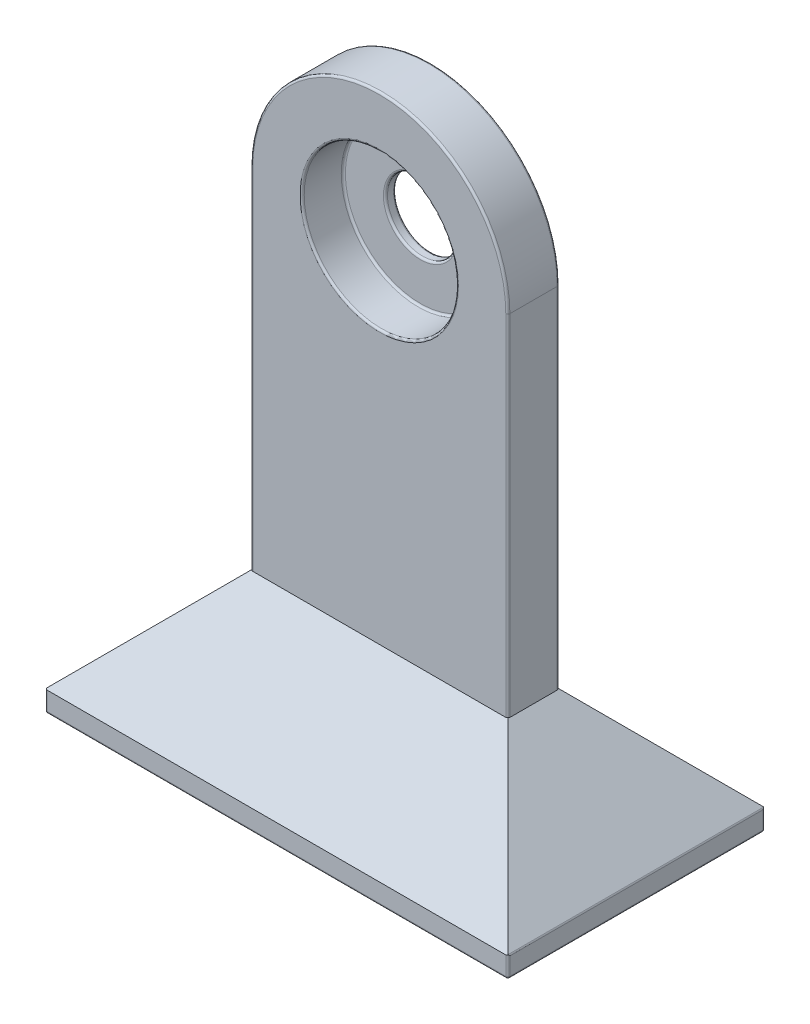
ISO-10303-21;
HEADER;
FILE_DESCRIPTION(('STEP AP214'),'2;1');
FILE_NAME('part.step','',(''),(''),'','','');
FILE_SCHEMA(('AUTOMOTIVE_DESIGN { 1 0 10303 214 1 1 1 1 }'));
ENDSEC;
DATA;
#1=APPLICATION_CONTEXT('core data for automotive mechanical design processes');
#2=APPLICATION_PROTOCOL_DEFINITION('international standard','automotive_design',2000,#1);
#3=PRODUCT_CONTEXT('',#1,'mechanical');
#4=PRODUCT('Part','Part','',(#3));
#5=PRODUCT_RELATED_PRODUCT_CATEGORY('part','',(#4));
#6=PRODUCT_DEFINITION_FORMATION('','',#4);
#7=PRODUCT_DEFINITION_CONTEXT('part definition',#1,'design');
#8=PRODUCT_DEFINITION('design','',#6,#7);
#9=PRODUCT_DEFINITION_SHAPE('','',#8);
#10=(LENGTH_UNIT() NAMED_UNIT(*) SI_UNIT(.MILLI.,.METRE.));
#11=(NAMED_UNIT(*) PLANE_ANGLE_UNIT() SI_UNIT($,.RADIAN.));
#12=(NAMED_UNIT(*) SI_UNIT($,.STERADIAN.) SOLID_ANGLE_UNIT());
#13=UNCERTAINTY_MEASURE_WITH_UNIT(LENGTH_MEASURE(1.E-05),#10,'distance_accuracy_value','');
#14=(GEOMETRIC_REPRESENTATION_CONTEXT(3) GLOBAL_UNCERTAINTY_ASSIGNED_CONTEXT((#13)) GLOBAL_UNIT_ASSIGNED_CONTEXT((#10,
#11,#12)) REPRESENTATION_CONTEXT('',''));
#15=CARTESIAN_POINT('',(0.,0.,0.));
#16=DIRECTION('',(0.,0.,1.));
#17=DIRECTION('',(1.,0.,0.));
#18=AXIS2_PLACEMENT_3D('',#15,#16,#17);
#19=CARTESIAN_POINT('',(0.,0.,2.5));
#20=DIRECTION('',(0.,0.,-1.));
#21=DIRECTION('',(-1.,0.,0.));
#22=AXIS2_PLACEMENT_3D('',#19,#20,#21);
#23=CYLINDRICAL_SURFACE('',#22,7.5);
#24=CARTESIAN_POINT('',(0.,0.,-1.3));
#25=DIRECTION('',(0.,0.,-1.));
#26=DIRECTION('',(-1.,0.,0.));
#27=AXIS2_PLACEMENT_3D('',#24,#25,#26);
#28=CIRCLE('',#27,7.5);
#29=CARTESIAN_POINT('',(-7.5,0.,-1.3));
#30=VERTEX_POINT('',#29);
#31=EDGE_CURVE('E515',#30,#30,#28,.T.);
#32=ORIENTED_EDGE('',*,*,#31,.T.);
#33=EDGE_LOOP('',(#32));
#34=FACE_BOUND('',#33,.T.);
#35=CARTESIAN_POINT('',(0.,0.,2.3));
#36=DIRECTION('',(0.,0.,1.));
#37=DIRECTION('',(1.,0.,0.));
#38=AXIS2_PLACEMENT_3D('',#35,#36,#37);
#39=CIRCLE('',#38,7.5);
#40=CARTESIAN_POINT('',(7.5,0.,2.3));
#41=VERTEX_POINT('',#40);
#42=EDGE_CURVE('E511',#41,#41,#39,.T.);
#43=ORIENTED_EDGE('',*,*,#42,.T.);
#44=EDGE_LOOP('',(#43));
#45=FACE_BOUND('',#44,.T.);
#46=ADVANCED_FACE('F47',(#34,#45),#23,.F.);
#47=CARTESIAN_POINT('',(0.,0.,2.5));
#48=DIRECTION('',(0.,0.,1.));
#49=DIRECTION('',(1.,0.,0.));
#50=AXIS2_PLACEMENT_3D('',#47,#48,#49);
#51=PLANE('',#50);
#52=CARTESIAN_POINT('',(0.,0.,2.5));
#53=DIRECTION('',(0.,0.,1.));
#54=DIRECTION('',(1.,0.,0.));
#55=AXIS2_PLACEMENT_3D('',#52,#53,#54);
#56=CIRCLE('',#55,7.7);
#57=CARTESIAN_POINT('',(7.7,0.,2.5));
#58=VERTEX_POINT('',#57);
#59=EDGE_CURVE('E535',#58,#58,#56,.F.);
#60=ORIENTED_EDGE('',*,*,#59,.T.);
#61=EDGE_LOOP('',(#60));
#62=FACE_BOUND('',#61,.T.);
#63=DIRECTION('',(1.,0.,0.));
#64=VECTOR('',#63,1.);
#65=CARTESIAN_POINT('',(0.,-34.,2.5));
#66=LINE('',#65,#64);
#67=CARTESIAN_POINT('',(-12.3,-34.,2.5));
#68=VERTEX_POINT('',#67);
#69=CARTESIAN_POINT('',(12.3,-34.,2.5));
#70=VERTEX_POINT('',#69);
#71=EDGE_CURVE('E203',#68,#70,#66,.T.);
#72=ORIENTED_EDGE('',*,*,#71,.T.);
#73=DIRECTION('',(0.,1.,0.));
#74=VECTOR('',#73,1.);
#75=CARTESIAN_POINT('',(12.3,0.,2.5));
#76=LINE('',#75,#74);
#77=CARTESIAN_POINT('',(12.3,0.,2.5));
#78=VERTEX_POINT('',#77);
#79=EDGE_CURVE('E212',#70,#78,#76,.T.);
#80=ORIENTED_EDGE('',*,*,#79,.T.);
#81=CARTESIAN_POINT('',(0.,0.,2.5));
#82=DIRECTION('',(0.,0.,1.));
#83=DIRECTION('',(1.,0.,0.));
#84=AXIS2_PLACEMENT_3D('',#81,#82,#83);
#85=CIRCLE('',#84,12.3);
#86=CARTESIAN_POINT('',(-12.3,0.,2.5));
#87=VERTEX_POINT('',#86);
#88=EDGE_CURVE('E206',#78,#87,#85,.T.);
#89=ORIENTED_EDGE('',*,*,#88,.T.);
#90=DIRECTION('',(0.,-1.,0.));
#91=VECTOR('',#90,1.);
#92=CARTESIAN_POINT('',(-12.3,-34.,2.5));
#93=LINE('',#92,#91);
#94=EDGE_CURVE('E199',#87,#68,#93,.T.);
#95=ORIENTED_EDGE('',*,*,#94,.T.);
#96=EDGE_LOOP('',(#72,#80,#89,#95));
#97=FACE_BOUND('',#96,.T.);
#98=ADVANCED_FACE('F201',(#62,#97),#51,.T.);
#99=CARTESIAN_POINT('',(0.,0.,-2.5));
#100=DIRECTION('',(0.,0.,1.));
#101=DIRECTION('',(1.,0.,0.));
#102=AXIS2_PLACEMENT_3D('',#99,#100,#101);
#103=PLANE('',#102);
#104=CARTESIAN_POINT('',(0.,0.,-2.5));
#105=DIRECTION('',(0.,0.,1.));
#106=DIRECTION('',(1.,0.,0.));
#107=AXIS2_PLACEMENT_3D('',#104,#105,#106);
#108=CIRCLE('',#107,3.6);
#109=CARTESIAN_POINT('',(3.6,0.,-2.5));
#110=VERTEX_POINT('',#109);
#111=EDGE_CURVE('E563',#110,#110,#108,.T.);
#112=ORIENTED_EDGE('',*,*,#111,.T.);
#113=EDGE_LOOP('',(#112));
#114=FACE_BOUND('',#113,.T.);
#115=CARTESIAN_POINT('',(0.,0.,-2.5));
#116=DIRECTION('',(0.,0.,1.));
#117=DIRECTION('',(1.,0.,0.));
#118=AXIS2_PLACEMENT_3D('',#115,#116,#117);
#119=CIRCLE('',#118,12.3);
#120=CARTESIAN_POINT('',(-12.3,0.,-2.5));
#121=VERTEX_POINT('',#120);
#122=CARTESIAN_POINT('',(12.3,0.,-2.5));
#123=VERTEX_POINT('',#122);
#124=EDGE_CURVE('E554',#121,#123,#119,.F.);
#125=ORIENTED_EDGE('',*,*,#124,.T.);
#126=DIRECTION('',(0.,1.,0.));
#127=VECTOR('',#126,1.);
#128=CARTESIAN_POINT('',(12.3,0.,-2.5));
#129=LINE('',#128,#127);
#130=CARTESIAN_POINT('',(12.3,-34.,-2.50000000000001));
#131=VERTEX_POINT('',#130);
#132=EDGE_CURVE('E560',#123,#131,#129,.F.);
#133=ORIENTED_EDGE('',*,*,#132,.T.);
#134=DIRECTION('',(1.,0.,0.));
#135=VECTOR('',#134,1.);
#136=CARTESIAN_POINT('',(0.,-34.,-2.50000000000001));
#137=LINE('',#136,#135);
#138=CARTESIAN_POINT('',(-12.3,-34.,-2.50000000000001));
#139=VERTEX_POINT('',#138);
#140=EDGE_CURVE('E224',#139,#131,#137,.T.);
#141=ORIENTED_EDGE('',*,*,#140,.F.);
#142=DIRECTION('',(0.,-1.,0.));
#143=VECTOR('',#142,1.);
#144=CARTESIAN_POINT('',(-12.3,0.,-2.5));
#145=LINE('',#144,#143);
#146=EDGE_CURVE('E557',#139,#121,#145,.F.);
#147=ORIENTED_EDGE('',*,*,#146,.T.);
#148=EDGE_LOOP('',(#125,#133,#141,#147));
#149=FACE_BOUND('',#148,.T.);
#150=ADVANCED_FACE('F657',(#114,#149),#103,.F.);
#151=CARTESIAN_POINT('',(0.,0.,2.5));
#152=DIRECTION('',(0.,0.,-1.));
#153=DIRECTION('',(-1.,0.,0.));
#154=AXIS2_PLACEMENT_3D('',#151,#152,#153);
#155=CYLINDRICAL_SURFACE('',#154,12.5);
#156=DIRECTION('',(0.,0.,-1.));
#157=VECTOR('',#156,1.);
#158=CARTESIAN_POINT('',(-12.5,0.,2.5));
#159=LINE('',#158,#157);
#160=CARTESIAN_POINT('',(-12.5,0.,2.3));
#161=VERTEX_POINT('',#160);
#162=CARTESIAN_POINT('',(-12.5,0.,-2.3));
#163=VERTEX_POINT('',#162);
#164=EDGE_CURVE('E333',#161,#163,#159,.T.);
#165=ORIENTED_EDGE('',*,*,#164,.F.);
#166=CARTESIAN_POINT('',(0.,0.,2.3));
#167=DIRECTION('',(0.,0.,1.));
#168=DIRECTION('',(1.,0.,0.));
#169=AXIS2_PLACEMENT_3D('',#166,#167,#168);
#170=CIRCLE('',#169,12.5);
#171=CARTESIAN_POINT('',(12.5,0.,2.3));
#172=VERTEX_POINT('',#171);
#173=EDGE_CURVE('E522',#161,#172,#170,.F.);
#174=ORIENTED_EDGE('',*,*,#173,.T.);
#175=DIRECTION('',(0.,0.,-1.));
#176=VECTOR('',#175,1.);
#177=CARTESIAN_POINT('',(12.5,0.,2.5));
#178=LINE('',#177,#176);
#179=CARTESIAN_POINT('',(12.5,0.,-2.3));
#180=VERTEX_POINT('',#179);
#181=EDGE_CURVE('E223',#172,#180,#178,.T.);
#182=ORIENTED_EDGE('',*,*,#181,.T.);
#183=CARTESIAN_POINT('',(0.,0.,-2.3));
#184=DIRECTION('',(0.,0.,1.));
#185=DIRECTION('',(1.,0.,0.));
#186=AXIS2_PLACEMENT_3D('',#183,#184,#185);
#187=CIRCLE('',#186,12.5);
#188=EDGE_CURVE('E519',#180,#163,#187,.T.);
#189=ORIENTED_EDGE('',*,*,#188,.T.);
#190=EDGE_LOOP('',(#165,#174,#182,#189));
#191=FACE_BOUND('',#190,.T.);
#192=ADVANCED_FACE('F673',(#191),#155,.T.);
#193=CARTESIAN_POINT('',(-12.5,0.,2.5));
#194=DIRECTION('',(1.,0.,0.));
#195=DIRECTION('',(0.,1.,0.));
#196=AXIS2_PLACEMENT_3D('',#193,#194,#195);
#197=PLANE('',#196);
#198=DIRECTION('',(0.,0.,1.));
#199=VECTOR('',#198,1.);
#200=CARTESIAN_POINT('',(-12.5,-34.,0.));
#201=LINE('',#200,#199);
#202=CARTESIAN_POINT('',(-12.5,-34.,2.3));
#203=VERTEX_POINT('',#202);
#204=CARTESIAN_POINT('',(-12.5,-34.,-2.3));
#205=VERTEX_POINT('',#204);
#206=EDGE_CURVE('E337',#203,#205,#201,.F.);
#207=ORIENTED_EDGE('',*,*,#206,.F.);
#208=DIRECTION('',(0.,-1.,0.));
#209=VECTOR('',#208,1.);
#210=CARTESIAN_POINT('',(-12.5,0.,2.3));
#211=LINE('',#210,#209);
#212=EDGE_CURVE('E551',#203,#161,#211,.F.);
#213=ORIENTED_EDGE('',*,*,#212,.T.);
#214=ORIENTED_EDGE('',*,*,#164,.T.);
#215=DIRECTION('',(0.,-1.,0.));
#216=VECTOR('',#215,1.);
#217=CARTESIAN_POINT('',(-12.5,0.,-2.3));
#218=LINE('',#217,#216);
#219=EDGE_CURVE('E548',#163,#205,#218,.T.);
#220=ORIENTED_EDGE('',*,*,#219,.T.);
#221=EDGE_LOOP('',(#207,#213,#214,#220));
#222=FACE_BOUND('',#221,.T.);
#223=ADVANCED_FACE('F679',(#222),#197,.F.);
#224=CARTESIAN_POINT('',(12.5,-34.,2.5));
#225=DIRECTION('',(-1.,0.,0.));
#226=DIRECTION('',(0.,-1.,0.));
#227=AXIS2_PLACEMENT_3D('',#224,#225,#226);
#228=PLANE('',#227);
#229=ORIENTED_EDGE('',*,*,#181,.F.);
#230=DIRECTION('',(0.,1.,0.));
#231=VECTOR('',#230,1.);
#232=CARTESIAN_POINT('',(12.5,-34.,2.3));
#233=LINE('',#232,#231);
#234=CARTESIAN_POINT('',(12.5,-34.,2.3));
#235=VERTEX_POINT('',#234);
#236=EDGE_CURVE('E545',#172,#235,#233,.F.);
#237=ORIENTED_EDGE('',*,*,#236,.T.);
#238=DIRECTION('',(0.,0.,1.));
#239=VECTOR('',#238,1.);
#240=CARTESIAN_POINT('',(12.5,-34.,2.5));
#241=LINE('',#240,#239);
#242=CARTESIAN_POINT('',(12.5,-34.,-2.3));
#243=VERTEX_POINT('',#242);
#244=EDGE_CURVE('E332',#235,#243,#241,.F.);
#245=ORIENTED_EDGE('',*,*,#244,.T.);
#246=DIRECTION('',(0.,1.,0.));
#247=VECTOR('',#246,1.);
#248=CARTESIAN_POINT('',(12.5,-34.,-2.3));
#249=LINE('',#248,#247);
#250=EDGE_CURVE('E539',#243,#180,#249,.T.);
#251=ORIENTED_EDGE('',*,*,#250,.T.);
#252=EDGE_LOOP('',(#229,#237,#245,#251));
#253=FACE_BOUND('',#252,.T.);
#254=ADVANCED_FACE('F672',(#253),#228,.F.);
#255=CARTESIAN_POINT('',(0.,0.,-1.5));
#256=DIRECTION('',(0.,0.,-1.));
#257=DIRECTION('',(-1.,0.,0.));
#258=AXIS2_PLACEMENT_3D('',#255,#256,#257);
#259=PLANE('',#258);
#260=CARTESIAN_POINT('',(0.,0.,-1.5));
#261=DIRECTION('',(0.,0.,-1.));
#262=DIRECTION('',(-1.,0.,0.));
#263=AXIS2_PLACEMENT_3D('',#260,#261,#262);
#264=CIRCLE('',#263,3.6);
#265=CARTESIAN_POINT('',(-3.6,0.,-1.5));
#266=VERTEX_POINT('',#265);
#267=EDGE_CURVE('E507',#266,#266,#264,.T.);
#268=ORIENTED_EDGE('',*,*,#267,.T.);
#269=EDGE_LOOP('',(#268));
#270=FACE_BOUND('',#269,.T.);
#271=CARTESIAN_POINT('',(0.,0.,-1.5));
#272=DIRECTION('',(0.,0.,-1.));
#273=DIRECTION('',(-1.,0.,0.));
#274=AXIS2_PLACEMENT_3D('',#271,#272,#273);
#275=CIRCLE('',#274,7.3);
#276=CARTESIAN_POINT('',(-7.3,0.,-1.5));
#277=VERTEX_POINT('',#276);
#278=EDGE_CURVE('E503',#277,#277,#275,.F.);
#279=ORIENTED_EDGE('',*,*,#278,.T.);
#280=EDGE_LOOP('',(#279));
#281=FACE_BOUND('',#280,.T.);
#282=ADVANCED_FACE('F686',(#270,#281),#259,.F.);
#283=CARTESIAN_POINT('',(0.,0.,-1.5));
#284=DIRECTION('',(0.,0.,-1.));
#285=DIRECTION('',(-1.,0.,0.));
#286=AXIS2_PLACEMENT_3D('',#283,#284,#285);
#287=CYLINDRICAL_SURFACE('',#286,3.4);
#288=CARTESIAN_POINT('',(0.,0.,-2.3));
#289=DIRECTION('',(0.,0.,1.));
#290=DIRECTION('',(1.,0.,0.));
#291=AXIS2_PLACEMENT_3D('',#288,#289,#290);
#292=CIRCLE('',#291,3.4);
#293=CARTESIAN_POINT('',(3.4,0.,-2.3));
#294=VERTEX_POINT('',#293);
#295=EDGE_CURVE('E499',#294,#294,#292,.F.);
#296=ORIENTED_EDGE('',*,*,#295,.T.);
#297=EDGE_LOOP('',(#296));
#298=FACE_BOUND('',#297,.T.);
#299=CARTESIAN_POINT('',(0.,0.,-1.7));
#300=DIRECTION('',(0.,0.,-1.));
#301=DIRECTION('',(-1.,0.,0.));
#302=AXIS2_PLACEMENT_3D('',#299,#300,#301);
#303=CIRCLE('',#302,3.4);
#304=CARTESIAN_POINT('',(-3.4,0.,-1.7));
#305=VERTEX_POINT('',#304);
#306=EDGE_CURVE('E495',#305,#305,#303,.F.);
#307=ORIENTED_EDGE('',*,*,#306,.T.);
#308=EDGE_LOOP('',(#307));
#309=FACE_BOUND('',#308,.T.);
#310=ADVANCED_FACE('F377',(#298,#309),#287,.F.);
#311=CARTESIAN_POINT('',(-10.75,-10.75,0.));
#312=DIRECTION('',(-0.707106781186548,-0.707106781186548,0.));
#313=DIRECTION('',(0.707106781186548,-0.707106781186548,0.));
#314=AXIS2_PLACEMENT_3D('',#311,#312,#313);
#315=PLANE('',#314);
#316=DIRECTION('',(-0.577350269189626,0.577350269189626,-0.577350269189626));
#317=VECTOR('',#316,1.);
#318=CARTESIAN_POINT('',(22.5,-44.,12.5));
#319=LINE('',#318,#317);
#320=CARTESIAN_POINT('',(22.4414213562373,-43.9414213562373,12.4414213562373));
#321=VERTEX_POINT('',#320);
#322=CARTESIAN_POINT('',(12.4414213562373,-33.9414213562373,2.44142135623731));
#323=VERTEX_POINT('',#322);
#324=EDGE_CURVE('E447',#321,#323,#319,.T.);
#325=ORIENTED_EDGE('',*,*,#324,.F.);
#326=DIRECTION('',(0.,0.,1.));
#327=VECTOR('',#326,1.);
#328=CARTESIAN_POINT('',(22.4414213562373,-43.9414213562373,0.));
#329=LINE('',#328,#327);
#330=CARTESIAN_POINT('',(22.4414213562373,-43.9414213562373,-12.4414213562373));
#331=VERTEX_POINT('',#330);
#332=EDGE_CURVE('E479',#321,#331,#329,.F.);
#333=ORIENTED_EDGE('',*,*,#332,.T.);
#334=DIRECTION('',(-0.577350269189626,0.577350269189626,0.577350269189626));
#335=VECTOR('',#334,1.);
#336=CARTESIAN_POINT('',(22.5,-44.,-12.5));
#337=LINE('',#336,#335);
#338=CARTESIAN_POINT('',(12.4414213562373,-33.9414213562373,-2.44142135623731));
#339=VERTEX_POINT('',#338);
#340=EDGE_CURVE('E73',#331,#339,#337,.T.);
#341=ORIENTED_EDGE('',*,*,#340,.T.);
#342=CARTESIAN_POINT('',(12.3,-33.8,-2.3));
#343=DIRECTION('',(-0.707106781186548,-0.707106781186548,0.));
#344=DIRECTION('',(-0.707106781186548,0.707106781186548,0.));
#345=AXIS2_PLACEMENT_3D('',#342,#343,#344);
#346=ELLIPSE('',#345,0.282842712474619,0.2);
#347=EDGE_CURVE('E241',#339,#243,#346,.T.);
#348=ORIENTED_EDGE('',*,*,#347,.T.);
#349=ORIENTED_EDGE('',*,*,#244,.F.);
#350=CARTESIAN_POINT('',(12.3,-33.8,2.3));
#351=DIRECTION('',(-0.707106781186548,-0.707106781186548,0.));
#352=DIRECTION('',(0.707106781186548,-0.707106781186548,0.));
#353=AXIS2_PLACEMENT_3D('',#350,#351,#352);
#354=ELLIPSE('',#353,0.282842712474619,0.2);
#355=EDGE_CURVE('E235',#235,#323,#354,.T.);
#356=ORIENTED_EDGE('',*,*,#355,.T.);
#357=EDGE_LOOP('',(#325,#333,#341,#348,#349,#356));
#358=FACE_BOUND('',#357,.T.);
#359=ADVANCED_FACE('F374',(#358),#315,.F.);
#360=CARTESIAN_POINT('',(0.,-15.75,-15.75));
#361=DIRECTION('',(0.,-0.707106781186547,-0.707106781186547));
#362=DIRECTION('',(0.,0.707106781186548,-0.707106781186547));
#363=AXIS2_PLACEMENT_3D('',#360,#361,#362);
#364=PLANE('',#363);
#365=DIRECTION('',(0.577350269189626,0.577350269189626,-0.577350269189626));
#366=VECTOR('',#365,1.);
#367=CARTESIAN_POINT('',(-22.5,-44.,12.5));
#368=LINE('',#367,#366);
#369=CARTESIAN_POINT('',(-22.4414213562373,-43.9414213562373,12.4414213562373));
#370=VERTEX_POINT('',#369);
#371=CARTESIAN_POINT('',(-12.4414213562373,-33.9414213562373,2.44142135623731));
#372=VERTEX_POINT('',#371);
#373=EDGE_CURVE('E347',#370,#372,#368,.T.);
#374=ORIENTED_EDGE('',*,*,#373,.F.);
#375=CARTESIAN_POINT('',(-22.3,-43.8,12.3));
#376=DIRECTION('',(0.,-0.707106781186547,-0.707106781186547));
#377=DIRECTION('',(0.,0.707106781186548,-0.707106781186547));
#378=AXIS2_PLACEMENT_3D('',#375,#376,#377);
#379=ELLIPSE('',#378,0.282842712474619,0.2);
#380=CARTESIAN_POINT('',(-22.3,-44.,12.5));
#381=VERTEX_POINT('',#380);
#382=EDGE_CURVE('E404',#370,#381,#379,.F.);
#383=ORIENTED_EDGE('',*,*,#382,.T.);
#384=DIRECTION('',(-1.,0.,0.));
#385=VECTOR('',#384,1.);
#386=CARTESIAN_POINT('',(22.5,-44.,12.5));
#387=LINE('',#386,#385);
#388=CARTESIAN_POINT('',(22.3,-44.,12.5));
#389=VERTEX_POINT('',#388);
#390=EDGE_CURVE('E51',#389,#381,#387,.T.);
#391=ORIENTED_EDGE('',*,*,#390,.F.);
#392=CARTESIAN_POINT('',(22.3,-43.8,12.3));
#393=DIRECTION('',(0.,-0.707106781186547,-0.707106781186547));
#394=DIRECTION('',(0.,0.707106781186548,-0.707106781186547));
#395=AXIS2_PLACEMENT_3D('',#392,#393,#394);
#396=ELLIPSE('',#395,0.282842712474619,0.2);
#397=EDGE_CURVE('E401',#389,#321,#396,.F.);
#398=ORIENTED_EDGE('',*,*,#397,.T.);
#399=ORIENTED_EDGE('',*,*,#324,.T.);
#400=CARTESIAN_POINT('',(12.3,-33.8,2.3));
#401=DIRECTION('',(0.,-0.707106781186547,-0.707106781186547));
#402=DIRECTION('',(0.,-0.707106781186548,0.707106781186547));
#403=AXIS2_PLACEMENT_3D('',#400,#401,#402);
#404=ELLIPSE('',#403,0.282842712474619,0.2);
#405=EDGE_CURVE('E221',#323,#70,#404,.T.);
#406=ORIENTED_EDGE('',*,*,#405,.T.);
#407=ORIENTED_EDGE('',*,*,#71,.F.);
#408=CARTESIAN_POINT('',(-12.3,-33.8,2.3));
#409=DIRECTION('',(0.,-0.707106781186547,-0.707106781186547));
#410=DIRECTION('',(0.,0.707106781186548,-0.707106781186547));
#411=AXIS2_PLACEMENT_3D('',#408,#409,#410);
#412=ELLIPSE('',#411,0.282842712474619,0.2);
#413=EDGE_CURVE('E218',#68,#372,#412,.T.);
#414=ORIENTED_EDGE('',*,*,#413,.T.);
#415=EDGE_LOOP('',(#374,#383,#391,#398,#399,#406,#407,#414));
#416=FACE_BOUND('',#415,.T.);
#417=ADVANCED_FACE('F217',(#416),#364,.F.);
#418=CARTESIAN_POINT('',(0.,-15.75,15.75));
#419=DIRECTION('',(0.,-0.707106781186547,0.707106781186547));
#420=DIRECTION('',(0.,-0.707106781186548,-0.707106781186547));
#421=AXIS2_PLACEMENT_3D('',#418,#419,#420);
#422=PLANE('',#421);
#423=DIRECTION('',(1.,0.,0.));
#424=VECTOR('',#423,1.);
#425=CARTESIAN_POINT('',(22.5,-44.,-12.5));
#426=LINE('',#425,#424);
#427=CARTESIAN_POINT('',(-22.3,-44.,-12.5));
#428=VERTEX_POINT('',#427);
#429=CARTESIAN_POINT('',(22.3,-44.,-12.5));
#430=VERTEX_POINT('',#429);
#431=EDGE_CURVE('E319',#428,#430,#426,.T.);
#432=ORIENTED_EDGE('',*,*,#431,.F.);
#433=CARTESIAN_POINT('',(-22.3,-43.8,-12.3));
#434=DIRECTION('',(0.,-0.707106781186547,0.707106781186547));
#435=DIRECTION('',(0.,0.707106781186548,0.707106781186547));
#436=AXIS2_PLACEMENT_3D('',#433,#434,#435);
#437=ELLIPSE('',#436,0.282842712474619,0.2);
#438=CARTESIAN_POINT('',(-22.4414213562373,-43.9414213562373,-12.4414213562373));
#439=VERTEX_POINT('',#438);
#440=EDGE_CURVE('E455',#428,#439,#437,.F.);
#441=ORIENTED_EDGE('',*,*,#440,.T.);
#442=DIRECTION('',(0.577350269189626,0.577350269189626,0.577350269189626));
#443=VECTOR('',#442,1.);
#444=CARTESIAN_POINT('',(-22.5,-44.,-12.5));
#445=LINE('',#444,#443);
#446=CARTESIAN_POINT('',(-12.4414213562373,-33.9414213562373,-2.44142135623731));
#447=VERTEX_POINT('',#446);
#448=EDGE_CURVE('E65',#439,#447,#445,.T.);
#449=ORIENTED_EDGE('',*,*,#448,.T.);
#450=CARTESIAN_POINT('',(-12.3,-33.8,-2.3));
#451=DIRECTION('',(0.,-0.707106781186547,0.707106781186547));
#452=DIRECTION('',(0.,-0.707106781186548,-0.707106781186547));
#453=AXIS2_PLACEMENT_3D('',#450,#451,#452);
#454=ELLIPSE('',#453,0.282842712474619,0.2);
#455=EDGE_CURVE('E12',#447,#139,#454,.T.);
#456=ORIENTED_EDGE('',*,*,#455,.T.);
#457=ORIENTED_EDGE('',*,*,#140,.T.);
#458=CARTESIAN_POINT('',(12.3,-33.8,-2.3));
#459=DIRECTION('',(0.,-0.707106781186547,0.707106781186547));
#460=DIRECTION('',(0.,0.707106781186548,0.707106781186547));
#461=AXIS2_PLACEMENT_3D('',#458,#459,#460);
#462=ELLIPSE('',#461,0.282842712474619,0.2);
#463=EDGE_CURVE('E233',#131,#339,#462,.T.);
#464=ORIENTED_EDGE('',*,*,#463,.T.);
#465=ORIENTED_EDGE('',*,*,#340,.F.);
#466=CARTESIAN_POINT('',(22.3,-43.8,-12.3));
#467=DIRECTION('',(0.,-0.707106781186547,0.707106781186547));
#468=DIRECTION('',(0.,0.707106781186548,0.707106781186547));
#469=AXIS2_PLACEMENT_3D('',#466,#467,#468);
#470=ELLIPSE('',#469,0.282842712474619,0.2);
#471=EDGE_CURVE('E452',#331,#430,#470,.F.);
#472=ORIENTED_EDGE('',*,*,#471,.T.);
#473=EDGE_LOOP('',(#432,#441,#449,#456,#457,#464,#465,#472));
#474=FACE_BOUND('',#473,.T.);
#475=ADVANCED_FACE('F381',(#474),#422,.F.);
#476=CARTESIAN_POINT('',(10.75,-10.75,0.));
#477=DIRECTION('',(0.707106781186548,-0.707106781186548,0.));
#478=DIRECTION('',(0.707106781186548,0.707106781186548,0.));
#479=AXIS2_PLACEMENT_3D('',#476,#477,#478);
#480=PLANE('',#479);
#481=ORIENTED_EDGE('',*,*,#448,.F.);
#482=DIRECTION('',(0.,0.,-1.));
#483=VECTOR('',#482,1.);
#484=CARTESIAN_POINT('',(-22.4414213562373,-43.9414213562373,0.));
#485=LINE('',#484,#483);
#486=EDGE_CURVE('E461',#439,#370,#485,.F.);
#487=ORIENTED_EDGE('',*,*,#486,.T.);
#488=ORIENTED_EDGE('',*,*,#373,.T.);
#489=CARTESIAN_POINT('',(-12.3,-33.8,2.3));
#490=DIRECTION('',(0.707106781186548,-0.707106781186548,0.));
#491=DIRECTION('',(0.707106781186548,0.707106781186548,0.));
#492=AXIS2_PLACEMENT_3D('',#489,#490,#491);
#493=ELLIPSE('',#492,0.282842712474619,0.2);
#494=EDGE_CURVE('E228',#372,#203,#493,.T.);
#495=ORIENTED_EDGE('',*,*,#494,.T.);
#496=ORIENTED_EDGE('',*,*,#206,.T.);
#497=CARTESIAN_POINT('',(-12.3,-33.8,-2.3));
#498=DIRECTION('',(0.707106781186548,-0.707106781186548,0.));
#499=DIRECTION('',(-0.707106781186548,-0.707106781186548,0.));
#500=AXIS2_PLACEMENT_3D('',#497,#498,#499);
#501=ELLIPSE('',#500,0.282842712474619,0.2);
#502=EDGE_CURVE('E58',#205,#447,#501,.T.);
#503=ORIENTED_EDGE('',*,*,#502,.T.);
#504=EDGE_LOOP('',(#481,#487,#488,#495,#496,#503));
#505=FACE_BOUND('',#504,.T.);
#506=ADVANCED_FACE('F372',(#505),#480,.F.);
#507=CARTESIAN_POINT('',(-22.5,-46.,12.5));
#508=DIRECTION('',(1.,0.,0.));
#509=DIRECTION('',(0.,0.,-1.));
#510=AXIS2_PLACEMENT_3D('',#507,#508,#509);
#511=PLANE('',#510);
#512=DIRECTION('',(0.,1.,0.));
#513=VECTOR('',#512,1.);
#514=CARTESIAN_POINT('',(-22.5,-46.,12.3));
#515=LINE('',#514,#513);
#516=CARTESIAN_POINT('',(-22.5,-45.8,12.3));
#517=VERTEX_POINT('',#516);
#518=CARTESIAN_POINT('',(-22.5,-44.0828427124746,12.3));
#519=VERTEX_POINT('',#518);
#520=EDGE_CURVE('E573',#517,#519,#515,.T.);
#521=ORIENTED_EDGE('',*,*,#520,.T.);
#522=DIRECTION('',(0.,0.,-1.));
#523=VECTOR('',#522,1.);
#524=CARTESIAN_POINT('',(-22.5,-44.0828427124746,12.5));
#525=LINE('',#524,#523);
#526=CARTESIAN_POINT('',(-22.5,-44.0828427124746,-12.3));
#527=VERTEX_POINT('',#526);
#528=EDGE_CURVE('E405',#519,#527,#525,.T.);
#529=ORIENTED_EDGE('',*,*,#528,.T.);
#530=DIRECTION('',(0.,1.,0.));
#531=VECTOR('',#530,1.);
#532=CARTESIAN_POINT('',(-22.5,-46.,-12.3));
#533=LINE('',#532,#531);
#534=CARTESIAN_POINT('',(-22.5,-45.8,-12.3));
#535=VERTEX_POINT('',#534);
#536=EDGE_CURVE('E570',#527,#535,#533,.F.);
#537=ORIENTED_EDGE('',*,*,#536,.T.);
#538=DIRECTION('',(0.,0.,-1.));
#539=VECTOR('',#538,1.);
#540=CARTESIAN_POINT('',(-22.5,-45.8,12.5));
#541=LINE('',#540,#539);
#542=EDGE_CURVE('E567',#535,#517,#541,.F.);
#543=ORIENTED_EDGE('',*,*,#542,.T.);
#544=EDGE_LOOP('',(#521,#529,#537,#543));
#545=FACE_BOUND('',#544,.T.);
#546=ADVANCED_FACE('F368',(#545),#511,.F.);
#547=CARTESIAN_POINT('',(-22.5,-46.,-12.5));
#548=DIRECTION('',(0.,0.,1.));
#549=DIRECTION('',(1.,0.,0.));
#550=AXIS2_PLACEMENT_3D('',#547,#548,#549);
#551=PLANE('',#550);
#552=DIRECTION('',(1.,0.,0.));
#553=VECTOR('',#552,1.);
#554=CARTESIAN_POINT('',(-22.5,-45.8,-12.5));
#555=LINE('',#554,#553);
#556=CARTESIAN_POINT('',(22.3,-45.8,-12.5));
#557=VERTEX_POINT('',#556);
#558=CARTESIAN_POINT('',(-22.3,-45.8,-12.5));
#559=VERTEX_POINT('',#558);
#560=EDGE_CURVE('E424',#557,#559,#555,.F.);
#561=ORIENTED_EDGE('',*,*,#560,.T.);
#562=DIRECTION('',(0.,1.,0.));
#563=VECTOR('',#562,1.);
#564=CARTESIAN_POINT('',(-22.3,-46.,-12.5));
#565=LINE('',#564,#563);
#566=EDGE_CURVE('E456',#559,#428,#565,.T.);
#567=ORIENTED_EDGE('',*,*,#566,.T.);
#568=ORIENTED_EDGE('',*,*,#431,.T.);
#569=DIRECTION('',(0.,1.,0.));
#570=VECTOR('',#569,1.);
#571=CARTESIAN_POINT('',(22.3,-46.,-12.5));
#572=LINE('',#571,#570);
#573=EDGE_CURVE('E636',#430,#557,#572,.F.);
#574=ORIENTED_EDGE('',*,*,#573,.T.);
#575=EDGE_LOOP('',(#561,#567,#568,#574));
#576=FACE_BOUND('',#575,.T.);
#577=ADVANCED_FACE('F357',(#576),#551,.F.);
#578=CARTESIAN_POINT('',(22.5,-46.,12.5));
#579=DIRECTION('',(-1.,0.,0.));
#580=DIRECTION('',(0.,0.,1.));
#581=AXIS2_PLACEMENT_3D('',#578,#579,#580);
#582=PLANE('',#581);
#583=DIRECTION('',(0.,1.,0.));
#584=VECTOR('',#583,1.);
#585=CARTESIAN_POINT('',(22.5,-46.,-12.3));
#586=LINE('',#585,#584);
#587=CARTESIAN_POINT('',(22.5,-45.8,-12.3));
#588=VERTEX_POINT('',#587);
#589=CARTESIAN_POINT('',(22.5,-44.0828427124746,-12.3));
#590=VERTEX_POINT('',#589);
#591=EDGE_CURVE('E472',#588,#590,#586,.T.);
#592=ORIENTED_EDGE('',*,*,#591,.T.);
#593=DIRECTION('',(0.,0.,1.));
#594=VECTOR('',#593,1.);
#595=CARTESIAN_POINT('',(22.5,-44.0828427124746,12.5));
#596=LINE('',#595,#594);
#597=CARTESIAN_POINT('',(22.5,-44.0828427124746,12.3));
#598=VERTEX_POINT('',#597);
#599=EDGE_CURVE('E476',#590,#598,#596,.T.);
#600=ORIENTED_EDGE('',*,*,#599,.T.);
#601=DIRECTION('',(0.,1.,0.));
#602=VECTOR('',#601,1.);
#603=CARTESIAN_POINT('',(22.5,-46.,12.3));
#604=LINE('',#603,#602);
#605=CARTESIAN_POINT('',(22.5,-45.8,12.3));
#606=VERTEX_POINT('',#605);
#607=EDGE_CURVE('E469',#598,#606,#604,.F.);
#608=ORIENTED_EDGE('',*,*,#607,.T.);
#609=DIRECTION('',(0.,0.,1.));
#610=VECTOR('',#609,1.);
#611=CARTESIAN_POINT('',(22.5,-45.8,-12.5));
#612=LINE('',#611,#610);
#613=EDGE_CURVE('E466',#606,#588,#612,.F.);
#614=ORIENTED_EDGE('',*,*,#613,.T.);
#615=EDGE_LOOP('',(#592,#600,#608,#614));
#616=FACE_BOUND('',#615,.T.);
#617=ADVANCED_FACE('F367',(#616),#582,.F.);
#618=CARTESIAN_POINT('',(-22.5,-46.,12.5));
#619=DIRECTION('',(0.,0.,-1.));
#620=DIRECTION('',(-1.,0.,0.));
#621=AXIS2_PLACEMENT_3D('',#618,#619,#620);
#622=PLANE('',#621);
#623=ORIENTED_EDGE('',*,*,#390,.T.);
#624=DIRECTION('',(0.,1.,0.));
#625=VECTOR('',#624,1.);
#626=CARTESIAN_POINT('',(-22.3,-46.,12.5));
#627=LINE('',#626,#625);
#628=CARTESIAN_POINT('',(-22.3,-45.8,12.5));
#629=VERTEX_POINT('',#628);
#630=EDGE_CURVE('E418',#381,#629,#627,.F.);
#631=ORIENTED_EDGE('',*,*,#630,.T.);
#632=DIRECTION('',(-1.,0.,0.));
#633=VECTOR('',#632,1.);
#634=CARTESIAN_POINT('',(22.5,-45.8,12.5));
#635=LINE('',#634,#633);
#636=CARTESIAN_POINT('',(22.3,-45.8,12.5));
#637=VERTEX_POINT('',#636);
#638=EDGE_CURVE('E410',#629,#637,#635,.F.);
#639=ORIENTED_EDGE('',*,*,#638,.T.);
#640=DIRECTION('',(0.,1.,0.));
#641=VECTOR('',#640,1.);
#642=CARTESIAN_POINT('',(22.3,-46.,12.5));
#643=LINE('',#642,#641);
#644=EDGE_CURVE('E415',#637,#389,#643,.T.);
#645=ORIENTED_EDGE('',*,*,#644,.T.);
#646=EDGE_LOOP('',(#623,#631,#639,#645));
#647=FACE_BOUND('',#646,.T.);
#648=ADVANCED_FACE('F595',(#647),#622,.F.);
#649=CARTESIAN_POINT('',(0.,-46.,0.));
#650=DIRECTION('',(0.,-1.,0.));
#651=DIRECTION('',(0.,0.,-1.));
#652=AXIS2_PLACEMENT_3D('',#649,#650,#651);
#653=PLANE('',#652);
#654=DIRECTION('',(0.,0.,1.));
#655=VECTOR('',#654,1.);
#656=CARTESIAN_POINT('',(22.3,-46.,12.5));
#657=LINE('',#656,#655);
#658=CARTESIAN_POINT('',(22.3,-46.,-12.3));
#659=VERTEX_POINT('',#658);
#660=CARTESIAN_POINT('',(22.3,-46.,12.3));
#661=VERTEX_POINT('',#660);
#662=EDGE_CURVE('E488',#659,#661,#657,.T.);
#663=ORIENTED_EDGE('',*,*,#662,.T.);
#664=DIRECTION('',(-1.,0.,0.));
#665=VECTOR('',#664,1.);
#666=CARTESIAN_POINT('',(-22.5,-46.,12.3));
#667=LINE('',#666,#665);
#668=CARTESIAN_POINT('',(-22.3,-46.,12.3));
#669=VERTEX_POINT('',#668);
#670=EDGE_CURVE('E491',#661,#669,#667,.T.);
#671=ORIENTED_EDGE('',*,*,#670,.T.);
#672=DIRECTION('',(0.,0.,-1.));
#673=VECTOR('',#672,1.);
#674=CARTESIAN_POINT('',(-22.3,-46.,-12.5));
#675=LINE('',#674,#673);
#676=CARTESIAN_POINT('',(-22.3,-46.,-12.3));
#677=VERTEX_POINT('',#676);
#678=EDGE_CURVE('E482',#669,#677,#675,.T.);
#679=ORIENTED_EDGE('',*,*,#678,.T.);
#680=DIRECTION('',(1.,0.,0.));
#681=VECTOR('',#680,1.);
#682=CARTESIAN_POINT('',(22.5,-46.,-12.3));
#683=LINE('',#682,#681);
#684=EDGE_CURVE('E485',#677,#659,#683,.T.);
#685=ORIENTED_EDGE('',*,*,#684,.T.);
#686=EDGE_LOOP('',(#663,#671,#679,#685));
#687=FACE_BOUND('',#686,.T.);
#688=ADVANCED_FACE('F613',(#687),#653,.T.);
#689=CARTESIAN_POINT('',(-12.3,0.,2.3));
#690=DIRECTION('',(0.,1.,0.));
#691=DIRECTION('',(-1.,0.,0.));
#692=AXIS2_PLACEMENT_3D('',#689,#690,#691);
#693=CYLINDRICAL_SURFACE('',#692,0.2);
#694=ORIENTED_EDGE('',*,*,#413,.F.);
#695=ORIENTED_EDGE('',*,*,#94,.F.);
#696=CARTESIAN_POINT('',(-12.3,0.,2.3));
#697=DIRECTION('',(0.,1.,0.));
#698=DIRECTION('',(-1.,0.,0.));
#699=AXIS2_PLACEMENT_3D('',#696,#697,#698);
#700=CIRCLE('',#699,0.2);
#701=EDGE_CURVE('E249',#161,#87,#700,.T.);
#702=ORIENTED_EDGE('',*,*,#701,.F.);
#703=ORIENTED_EDGE('',*,*,#212,.F.);
#704=ORIENTED_EDGE('',*,*,#494,.F.);
#705=EDGE_LOOP('',(#694,#695,#702,#703,#704));
#706=FACE_BOUND('',#705,.T.);
#707=ADVANCED_FACE('F226',(#706),#693,.T.);
#708=CARTESIAN_POINT('',(0.,0.,2.3));
#709=DIRECTION('',(0.,0.,1.));
#710=DIRECTION('',(1.,0.,0.));
#711=AXIS2_PLACEMENT_3D('',#708,#709,#710);
#712=TOROIDAL_SURFACE('',#711,12.3,0.2);
#713=ORIENTED_EDGE('',*,*,#701,.T.);
#714=ORIENTED_EDGE('',*,*,#88,.F.);
#715=CARTESIAN_POINT('',(12.3,0.,2.3));
#716=DIRECTION('',(0.,-1.,0.));
#717=DIRECTION('',(0.,0.,-1.));
#718=AXIS2_PLACEMENT_3D('',#715,#716,#717);
#719=CIRCLE('',#718,0.2);
#720=EDGE_CURVE('E246',#172,#78,#719,.T.);
#721=ORIENTED_EDGE('',*,*,#720,.F.);
#722=ORIENTED_EDGE('',*,*,#173,.F.);
#723=EDGE_LOOP('',(#713,#714,#721,#722));
#724=FACE_BOUND('',#723,.T.);
#725=ADVANCED_FACE('F676',(#724),#712,.T.);
#726=CARTESIAN_POINT('',(12.3,0.,2.3));
#727=DIRECTION('',(0.,-1.,0.));
#728=DIRECTION('',(1.,0.,0.));
#729=AXIS2_PLACEMENT_3D('',#726,#727,#728);
#730=CYLINDRICAL_SURFACE('',#729,0.2);
#731=ORIENTED_EDGE('',*,*,#355,.F.);
#732=ORIENTED_EDGE('',*,*,#236,.F.);
#733=ORIENTED_EDGE('',*,*,#720,.T.);
#734=ORIENTED_EDGE('',*,*,#79,.F.);
#735=ORIENTED_EDGE('',*,*,#405,.F.);
#736=EDGE_LOOP('',(#731,#732,#733,#734,#735));
#737=FACE_BOUND('',#736,.T.);
#738=ADVANCED_FACE('F532',(#737),#730,.T.);
#739=CARTESIAN_POINT('',(-12.3,0.,-2.3));
#740=DIRECTION('',(0.,-1.,0.));
#741=DIRECTION('',(1.,0.,0.));
#742=AXIS2_PLACEMENT_3D('',#739,#740,#741);
#743=CYLINDRICAL_SURFACE('',#742,0.2);
#744=ORIENTED_EDGE('',*,*,#502,.F.);
#745=ORIENTED_EDGE('',*,*,#219,.F.);
#746=CARTESIAN_POINT('',(-12.3,0.,-2.3));
#747=DIRECTION('',(0.,1.,0.));
#748=DIRECTION('',(-1.,0.,0.));
#749=AXIS2_PLACEMENT_3D('',#746,#747,#748);
#750=CIRCLE('',#749,0.2);
#751=EDGE_CURVE('E250',#121,#163,#750,.T.);
#752=ORIENTED_EDGE('',*,*,#751,.F.);
#753=ORIENTED_EDGE('',*,*,#146,.F.);
#754=ORIENTED_EDGE('',*,*,#455,.F.);
#755=EDGE_LOOP('',(#744,#745,#752,#753,#754));
#756=FACE_BOUND('',#755,.T.);
#757=ADVANCED_FACE('F652',(#756),#743,.T.);
#758=CARTESIAN_POINT('',(0.,0.,-2.3));
#759=DIRECTION('',(0.,0.,1.));
#760=DIRECTION('',(1.,0.,0.));
#761=AXIS2_PLACEMENT_3D('',#758,#759,#760);
#762=TOROIDAL_SURFACE('',#761,12.3,0.2);
#763=ORIENTED_EDGE('',*,*,#751,.T.);
#764=ORIENTED_EDGE('',*,*,#188,.F.);
#765=CARTESIAN_POINT('',(12.3,0.,-2.3));
#766=DIRECTION('',(0.,-1.,0.));
#767=DIRECTION('',(1.,0.,0.));
#768=AXIS2_PLACEMENT_3D('',#765,#766,#767);
#769=CIRCLE('',#768,0.2);
#770=EDGE_CURVE('E253',#123,#180,#769,.T.);
#771=ORIENTED_EDGE('',*,*,#770,.F.);
#772=ORIENTED_EDGE('',*,*,#124,.F.);
#773=EDGE_LOOP('',(#763,#764,#771,#772));
#774=FACE_BOUND('',#773,.T.);
#775=ADVANCED_FACE('F667',(#774),#762,.T.);
#776=CARTESIAN_POINT('',(12.3,-34.,-2.3));
#777=DIRECTION('',(0.,1.,0.));
#778=DIRECTION('',(-1.,0.,0.));
#779=AXIS2_PLACEMENT_3D('',#776,#777,#778);
#780=CYLINDRICAL_SURFACE('',#779,0.2);
#781=ORIENTED_EDGE('',*,*,#463,.F.);
#782=ORIENTED_EDGE('',*,*,#132,.F.);
#783=ORIENTED_EDGE('',*,*,#770,.T.);
#784=ORIENTED_EDGE('',*,*,#250,.F.);
#785=ORIENTED_EDGE('',*,*,#347,.F.);
#786=EDGE_LOOP('',(#781,#782,#783,#784,#785));
#787=FACE_BOUND('',#786,.T.);
#788=ADVANCED_FACE('F662',(#787),#780,.T.);
#789=CARTESIAN_POINT('',(22.3,-46.,-12.3));
#790=DIRECTION('',(0.,1.,0.));
#791=DIRECTION('',(0.,0.,1.));
#792=AXIS2_PLACEMENT_3D('',#789,#790,#791);
#793=CYLINDRICAL_SURFACE('',#792,0.2);
#794=ORIENTED_EDGE('',*,*,#573,.F.);
#795=ORIENTED_EDGE('',*,*,#471,.F.);
#796=CARTESIAN_POINT('',(22.3,-44.0828427124746,-12.3));
#797=DIRECTION('',(0.,0.707106781186547,0.707106781186547));
#798=DIRECTION('',(0.,-0.707106781186547,0.707106781186547));
#799=AXIS2_PLACEMENT_3D('',#796,#797,#798);
#800=ELLIPSE('',#799,0.282842712474619,0.2);
#801=EDGE_CURVE('E256',#590,#331,#800,.T.);
#802=ORIENTED_EDGE('',*,*,#801,.F.);
#803=ORIENTED_EDGE('',*,*,#591,.F.);
#804=CARTESIAN_POINT('',(22.3,-45.8,-12.3));
#805=DIRECTION('',(0.,-1.,0.));
#806=DIRECTION('',(0.,0.,-1.));
#807=AXIS2_PLACEMENT_3D('',#804,#805,#806);
#808=CIRCLE('',#807,0.2);
#809=EDGE_CURVE('E313',#557,#588,#808,.T.);
#810=ORIENTED_EDGE('',*,*,#809,.F.);
#811=EDGE_LOOP('',(#794,#795,#802,#803,#810));
#812=FACE_BOUND('',#811,.T.);
#813=ADVANCED_FACE('F625',(#812),#793,.T.);
#814=CARTESIAN_POINT('',(22.3,-44.0828427124746,12.5));
#815=DIRECTION('',(0.,0.,1.));
#816=DIRECTION('',(1.,0.,0.));
#817=AXIS2_PLACEMENT_3D('',#814,#815,#816);
#818=CYLINDRICAL_SURFACE('',#817,0.2);
#819=ORIENTED_EDGE('',*,*,#801,.T.);
#820=ORIENTED_EDGE('',*,*,#332,.F.);
#821=CARTESIAN_POINT('',(22.3,-44.0828427124746,12.3));
#822=DIRECTION('',(0.,-0.707106781186547,0.707106781186547));
#823=DIRECTION('',(0.,0.707106781186547,0.707106781186547));
#824=AXIS2_PLACEMENT_3D('',#821,#822,#823);
#825=ELLIPSE('',#824,0.282842712474619,0.2);
#826=EDGE_CURVE('E309',#598,#321,#825,.T.);
#827=ORIENTED_EDGE('',*,*,#826,.F.);
#828=ORIENTED_EDGE('',*,*,#599,.F.);
#829=EDGE_LOOP('',(#819,#820,#827,#828));
#830=FACE_BOUND('',#829,.T.);
#831=ADVANCED_FACE('F738',(#830),#818,.T.);
#832=CARTESIAN_POINT('',(22.3,-45.8,-12.3));
#833=DIRECTION('',(1.,0.,0.));
#834=DIRECTION('',(0.,0.,-1.));
#835=AXIS2_PLACEMENT_3D('',#832,#833,#834);
#836=SPHERICAL_SURFACE('',#835,0.2);
#837=CARTESIAN_POINT('',(22.3,-45.8,-12.3));
#838=DIRECTION('',(1.,0.,0.));
#839=DIRECTION('',(0.,0.,-1.));
#840=AXIS2_PLACEMENT_3D('',#837,#838,#839);
#841=CIRCLE('',#840,0.2);
#842=EDGE_CURVE('E301',#557,#659,#841,.F.);
#843=ORIENTED_EDGE('',*,*,#842,.F.);
#844=ORIENTED_EDGE('',*,*,#809,.T.);
#845=CARTESIAN_POINT('',(22.3,-45.8,-12.3));
#846=DIRECTION('',(0.,0.,-1.));
#847=DIRECTION('',(0.,1.,0.));
#848=AXIS2_PLACEMENT_3D('',#845,#846,#847);
#849=CIRCLE('',#848,0.2);
#850=EDGE_CURVE('E305',#659,#588,#849,.F.);
#851=ORIENTED_EDGE('',*,*,#850,.F.);
#852=EDGE_LOOP('',(#843,#844,#851));
#853=FACE_BOUND('',#852,.T.);
#854=ADVANCED_FACE('F629',(#853),#836,.T.);
#855=CARTESIAN_POINT('',(22.3,-46.,12.3));
#856=DIRECTION('',(0.,1.,0.));
#857=DIRECTION('',(0.,0.,1.));
#858=AXIS2_PLACEMENT_3D('',#855,#856,#857);
#859=CYLINDRICAL_SURFACE('',#858,0.2);
#860=ORIENTED_EDGE('',*,*,#397,.F.);
#861=ORIENTED_EDGE('',*,*,#644,.F.);
#862=CARTESIAN_POINT('',(22.3,-45.8,12.3));
#863=DIRECTION('',(0.,-1.,0.));
#864=DIRECTION('',(0.,0.,-1.));
#865=AXIS2_PLACEMENT_3D('',#862,#863,#864);
#866=CIRCLE('',#865,0.2);
#867=EDGE_CURVE('E297',#606,#637,#866,.T.);
#868=ORIENTED_EDGE('',*,*,#867,.F.);
#869=ORIENTED_EDGE('',*,*,#607,.F.);
#870=ORIENTED_EDGE('',*,*,#826,.T.);
#871=EDGE_LOOP('',(#860,#861,#868,#869,#870));
#872=FACE_BOUND('',#871,.T.);
#873=ADVANCED_FACE('F601',(#872),#859,.T.);
#874=CARTESIAN_POINT('',(22.3,-45.8,0.));
#875=DIRECTION('',(0.,0.,-1.));
#876=DIRECTION('',(-1.,0.,0.));
#877=AXIS2_PLACEMENT_3D('',#874,#875,#876);
#878=CYLINDRICAL_SURFACE('',#877,0.2);
#879=ORIENTED_EDGE('',*,*,#850,.T.);
#880=ORIENTED_EDGE('',*,*,#613,.F.);
#881=CARTESIAN_POINT('',(22.3,-45.8,12.3));
#882=DIRECTION('',(0.,0.,1.));
#883=DIRECTION('',(1.,0.,0.));
#884=AXIS2_PLACEMENT_3D('',#881,#882,#883);
#885=CIRCLE('',#884,0.2);
#886=EDGE_CURVE('E293',#661,#606,#885,.T.);
#887=ORIENTED_EDGE('',*,*,#886,.F.);
#888=ORIENTED_EDGE('',*,*,#662,.F.);
#889=EDGE_LOOP('',(#879,#880,#887,#888));
#890=FACE_BOUND('',#889,.T.);
#891=ADVANCED_FACE('F618',(#890),#878,.T.);
#892=CARTESIAN_POINT('',(0.,-45.8,-12.3));
#893=DIRECTION('',(-1.,0.,0.));
#894=DIRECTION('',(0.,0.,1.));
#895=AXIS2_PLACEMENT_3D('',#892,#893,#894);
#896=CYLINDRICAL_SURFACE('',#895,0.2);
#897=ORIENTED_EDGE('',*,*,#842,.T.);
#898=ORIENTED_EDGE('',*,*,#684,.F.);
#899=CARTESIAN_POINT('',(-22.3,-45.8,-12.3));
#900=DIRECTION('',(-1.,0.,0.));
#901=DIRECTION('',(0.,-1.,0.));
#902=AXIS2_PLACEMENT_3D('',#899,#900,#901);
#903=CIRCLE('',#902,0.2);
#904=EDGE_CURVE('E289',#559,#677,#903,.T.);
#905=ORIENTED_EDGE('',*,*,#904,.F.);
#906=ORIENTED_EDGE('',*,*,#560,.F.);
#907=EDGE_LOOP('',(#897,#898,#905,#906));
#908=FACE_BOUND('',#907,.T.);
#909=ADVANCED_FACE('F633',(#908),#896,.T.);
#910=CARTESIAN_POINT('',(22.3,-45.8,12.3));
#911=DIRECTION('',(1.,0.,0.));
#912=DIRECTION('',(0.,0.,-1.));
#913=AXIS2_PLACEMENT_3D('',#910,#911,#912);
#914=SPHERICAL_SURFACE('',#913,0.2);
#915=ORIENTED_EDGE('',*,*,#886,.T.);
#916=ORIENTED_EDGE('',*,*,#867,.T.);
#917=CARTESIAN_POINT('',(22.3,-45.8,12.3));
#918=DIRECTION('',(1.,0.,0.));
#919=DIRECTION('',(0.,0.,-1.));
#920=AXIS2_PLACEMENT_3D('',#917,#918,#919);
#921=CIRCLE('',#920,0.2);
#922=EDGE_CURVE('E285',#661,#637,#921,.F.);
#923=ORIENTED_EDGE('',*,*,#922,.F.);
#924=EDGE_LOOP('',(#915,#916,#923));
#925=FACE_BOUND('',#924,.T.);
#926=ADVANCED_FACE('F605',(#925),#914,.T.);
#927=CARTESIAN_POINT('',(-22.3,-45.8,-12.3));
#928=DIRECTION('',(0.,-1.,0.));
#929=DIRECTION('',(1.,0.,0.));
#930=AXIS2_PLACEMENT_3D('',#927,#928,#929);
#931=SPHERICAL_SURFACE('',#930,0.2);
#932=CARTESIAN_POINT('',(-22.3,-45.8,-12.3));
#933=DIRECTION('',(0.,-1.,0.));
#934=DIRECTION('',(0.,0.,-1.));
#935=AXIS2_PLACEMENT_3D('',#932,#933,#934);
#936=CIRCLE('',#935,0.2);
#937=EDGE_CURVE('E277',#559,#535,#936,.F.);
#938=ORIENTED_EDGE('',*,*,#937,.F.);
#939=ORIENTED_EDGE('',*,*,#904,.T.);
#940=CARTESIAN_POINT('',(-22.3,-45.8,-12.3));
#941=DIRECTION('',(0.,0.,-1.));
#942=DIRECTION('',(-1.,0.,0.));
#943=AXIS2_PLACEMENT_3D('',#940,#941,#942);
#944=CIRCLE('',#943,0.2);
#945=EDGE_CURVE('E281',#535,#677,#944,.F.);
#946=ORIENTED_EDGE('',*,*,#945,.F.);
#947=EDGE_LOOP('',(#938,#939,#946));
#948=FACE_BOUND('',#947,.T.);
#949=ADVANCED_FACE('F752',(#948),#931,.T.);
#950=CARTESIAN_POINT('',(0.,-45.8,12.3));
#951=DIRECTION('',(1.,0.,0.));
#952=DIRECTION('',(0.,0.,-1.));
#953=AXIS2_PLACEMENT_3D('',#950,#951,#952);
#954=CYLINDRICAL_SURFACE('',#953,0.2);
#955=ORIENTED_EDGE('',*,*,#922,.T.);
#956=ORIENTED_EDGE('',*,*,#638,.F.);
#957=CARTESIAN_POINT('',(-22.3,-45.8,12.3));
#958=DIRECTION('',(-1.,0.,0.));
#959=DIRECTION('',(0.,0.,1.));
#960=AXIS2_PLACEMENT_3D('',#957,#958,#959);
#961=CIRCLE('',#960,0.2);
#962=EDGE_CURVE('E273',#669,#629,#961,.T.);
#963=ORIENTED_EDGE('',*,*,#962,.F.);
#964=ORIENTED_EDGE('',*,*,#670,.F.);
#965=EDGE_LOOP('',(#955,#956,#963,#964));
#966=FACE_BOUND('',#965,.T.);
#967=ADVANCED_FACE('F609',(#966),#954,.T.);
#968=CARTESIAN_POINT('',(-22.3,-45.8,0.));
#969=DIRECTION('',(0.,0.,1.));
#970=DIRECTION('',(1.,0.,0.));
#971=AXIS2_PLACEMENT_3D('',#968,#969,#970);
#972=CYLINDRICAL_SURFACE('',#971,0.2);
#973=ORIENTED_EDGE('',*,*,#945,.T.);
#974=ORIENTED_EDGE('',*,*,#678,.F.);
#975=CARTESIAN_POINT('',(-22.3,-45.8,12.3));
#976=DIRECTION('',(0.,0.,1.));
#977=DIRECTION('',(1.,0.,0.));
#978=AXIS2_PLACEMENT_3D('',#975,#976,#977);
#979=CIRCLE('',#978,0.2);
#980=EDGE_CURVE('E270',#517,#669,#979,.T.);
#981=ORIENTED_EDGE('',*,*,#980,.F.);
#982=ORIENTED_EDGE('',*,*,#542,.F.);
#983=EDGE_LOOP('',(#973,#974,#981,#982));
#984=FACE_BOUND('',#983,.T.);
#985=ADVANCED_FACE('F758',(#984),#972,.T.);
#986=CARTESIAN_POINT('',(-22.3,-46.,-12.3));
#987=DIRECTION('',(0.,1.,0.));
#988=DIRECTION('',(0.,0.,1.));
#989=AXIS2_PLACEMENT_3D('',#986,#987,#988);
#990=CYLINDRICAL_SURFACE('',#989,0.2);
#991=ORIENTED_EDGE('',*,*,#937,.T.);
#992=ORIENTED_EDGE('',*,*,#536,.F.);
#993=CARTESIAN_POINT('',(-22.3,-44.0828427124746,-12.3));
#994=DIRECTION('',(0.,-0.707106781186547,-0.707106781186548));
#995=DIRECTION('',(0.,0.707106781186548,-0.707106781186547));
#996=AXIS2_PLACEMENT_3D('',#993,#994,#995);
#997=ELLIPSE('',#996,0.282842712474619,0.2);
#998=EDGE_CURVE('E266',#439,#527,#997,.F.);
#999=ORIENTED_EDGE('',*,*,#998,.F.);
#1000=ORIENTED_EDGE('',*,*,#440,.F.);
#1001=ORIENTED_EDGE('',*,*,#566,.F.);
#1002=EDGE_LOOP('',(#991,#992,#999,#1000,#1001));
#1003=FACE_BOUND('',#1002,.T.);
#1004=ADVANCED_FACE('F643',(#1003),#990,.T.);
#1005=CARTESIAN_POINT('',(-22.3,-45.8,12.3));
#1006=DIRECTION('',(0.,-1.,0.));
#1007=DIRECTION('',(1.,0.,0.));
#1008=AXIS2_PLACEMENT_3D('',#1005,#1006,#1007);
#1009=SPHERICAL_SURFACE('',#1008,0.2);
#1010=ORIENTED_EDGE('',*,*,#980,.T.);
#1011=ORIENTED_EDGE('',*,*,#962,.T.);
#1012=CARTESIAN_POINT('',(-22.3,-45.8,12.3));
#1013=DIRECTION('',(0.,-1.,0.));
#1014=DIRECTION('',(0.,0.,-1.));
#1015=AXIS2_PLACEMENT_3D('',#1012,#1013,#1014);
#1016=CIRCLE('',#1015,0.2);
#1017=EDGE_CURVE('E263',#517,#629,#1016,.F.);
#1018=ORIENTED_EDGE('',*,*,#1017,.F.);
#1019=EDGE_LOOP('',(#1010,#1011,#1018));
#1020=FACE_BOUND('',#1019,.T.);
#1021=ADVANCED_FACE('F764',(#1020),#1009,.T.);
#1022=CARTESIAN_POINT('',(-22.3,-44.0828427124746,12.5));
#1023=DIRECTION('',(0.,0.,-1.));
#1024=DIRECTION('',(-1.,0.,0.));
#1025=AXIS2_PLACEMENT_3D('',#1022,#1023,#1024);
#1026=CYLINDRICAL_SURFACE('',#1025,0.2);
#1027=ORIENTED_EDGE('',*,*,#998,.T.);
#1028=ORIENTED_EDGE('',*,*,#528,.F.);
#1029=CARTESIAN_POINT('',(-22.3,-44.0828427124746,12.3));
#1030=DIRECTION('',(0.,0.707106781186548,-0.707106781186547));
#1031=DIRECTION('',(0.,-0.707106781186547,-0.707106781186548));
#1032=AXIS2_PLACEMENT_3D('',#1029,#1030,#1031);
#1033=ELLIPSE('',#1032,0.282842712474619,0.2);
#1034=EDGE_CURVE('E260',#370,#519,#1033,.F.);
#1035=ORIENTED_EDGE('',*,*,#1034,.F.);
#1036=ORIENTED_EDGE('',*,*,#486,.F.);
#1037=EDGE_LOOP('',(#1027,#1028,#1035,#1036));
#1038=FACE_BOUND('',#1037,.T.);
#1039=ADVANCED_FACE('F588',(#1038),#1026,.T.);
#1040=CARTESIAN_POINT('',(-22.3,-46.,12.3));
#1041=DIRECTION('',(0.,1.,0.));
#1042=DIRECTION('',(0.,0.,1.));
#1043=AXIS2_PLACEMENT_3D('',#1040,#1041,#1042);
#1044=CYLINDRICAL_SURFACE('',#1043,0.2);
#1045=ORIENTED_EDGE('',*,*,#1017,.T.);
#1046=ORIENTED_EDGE('',*,*,#630,.F.);
#1047=ORIENTED_EDGE('',*,*,#382,.F.);
#1048=ORIENTED_EDGE('',*,*,#1034,.T.);
#1049=ORIENTED_EDGE('',*,*,#520,.F.);
#1050=EDGE_LOOP('',(#1045,#1046,#1047,#1048,#1049));
#1051=FACE_BOUND('',#1050,.T.);
#1052=ADVANCED_FACE('F592',(#1051),#1044,.T.);
#1053=CARTESIAN_POINT('',(0.,0.,-2.3));
#1054=DIRECTION('',(0.,0.,1.));
#1055=DIRECTION('',(1.,0.,0.));
#1056=AXIS2_PLACEMENT_3D('',#1053,#1054,#1055);
#1057=TOROIDAL_SURFACE('',#1056,3.6,0.2);
#1058=ORIENTED_EDGE('',*,*,#111,.F.);
#1059=EDGE_LOOP('',(#1058));
#1060=FACE_BOUND('',#1059,.T.);
#1061=ORIENTED_EDGE('',*,*,#295,.F.);
#1062=EDGE_LOOP('',(#1061));
#1063=FACE_BOUND('',#1062,.T.);
#1064=ADVANCED_FACE('F707',(#1060,#1063),#1057,.T.);
#1065=CARTESIAN_POINT('',(0.,0.,-1.7));
#1066=DIRECTION('',(0.,0.,-1.));
#1067=DIRECTION('',(-1.,0.,0.));
#1068=AXIS2_PLACEMENT_3D('',#1065,#1066,#1067);
#1069=TOROIDAL_SURFACE('',#1068,3.6,0.2);
#1070=ORIENTED_EDGE('',*,*,#306,.F.);
#1071=EDGE_LOOP('',(#1070));
#1072=FACE_BOUND('',#1071,.T.);
#1073=ORIENTED_EDGE('',*,*,#267,.F.);
#1074=EDGE_LOOP('',(#1073));
#1075=FACE_BOUND('',#1074,.T.);
#1076=ADVANCED_FACE('F710',(#1072,#1075),#1069,.T.);
#1077=CARTESIAN_POINT('',(0.,0.,-1.3));
#1078=DIRECTION('',(0.,0.,-1.));
#1079=DIRECTION('',(-1.,0.,0.));
#1080=AXIS2_PLACEMENT_3D('',#1077,#1078,#1079);
#1081=TOROIDAL_SURFACE('',#1080,7.3,0.2);
#1082=ORIENTED_EDGE('',*,*,#278,.F.);
#1083=EDGE_LOOP('',(#1082));
#1084=FACE_BOUND('',#1083,.T.);
#1085=ORIENTED_EDGE('',*,*,#31,.F.);
#1086=EDGE_LOOP('',(#1085));
#1087=FACE_BOUND('',#1086,.T.);
#1088=ADVANCED_FACE('F720',(#1084,#1087),#1081,.F.);
#1089=CARTESIAN_POINT('',(0.,0.,2.3));
#1090=DIRECTION('',(0.,0.,1.));
#1091=DIRECTION('',(1.,0.,0.));
#1092=AXIS2_PLACEMENT_3D('',#1089,#1090,#1091);
#1093=TOROIDAL_SURFACE('',#1092,7.7,0.2);
#1094=ORIENTED_EDGE('',*,*,#59,.F.);
#1095=EDGE_LOOP('',(#1094));
#1096=FACE_BOUND('',#1095,.T.);
#1097=ORIENTED_EDGE('',*,*,#42,.F.);
#1098=EDGE_LOOP('',(#1097));
#1099=FACE_BOUND('',#1098,.T.);
#1100=ADVANCED_FACE('F49',(#1096,#1099),#1093,.T.);
#1101=CLOSED_SHELL('',(#46,#98,#150,#192,#223,#254,#282,#310,#359,#417,#475,#506,#546,#577,#617,
#648,#688,#707,#725,#738,#757,#775,#788,#813,#831,#854,#873,#891,#909,#926,#949,#967,#985,#1004,
#1021,#1039,#1052,#1064,#1076,#1088,#1100));
#1102=MANIFOLD_SOLID_BREP('B2',#1101);
#1103=ADVANCED_BREP_SHAPE_REPRESENTATION('',(#18,#1102),#14);
#1104=SHAPE_DEFINITION_REPRESENTATION(#9,#1103);
ENDSEC;
END-ISO-10303-21;
